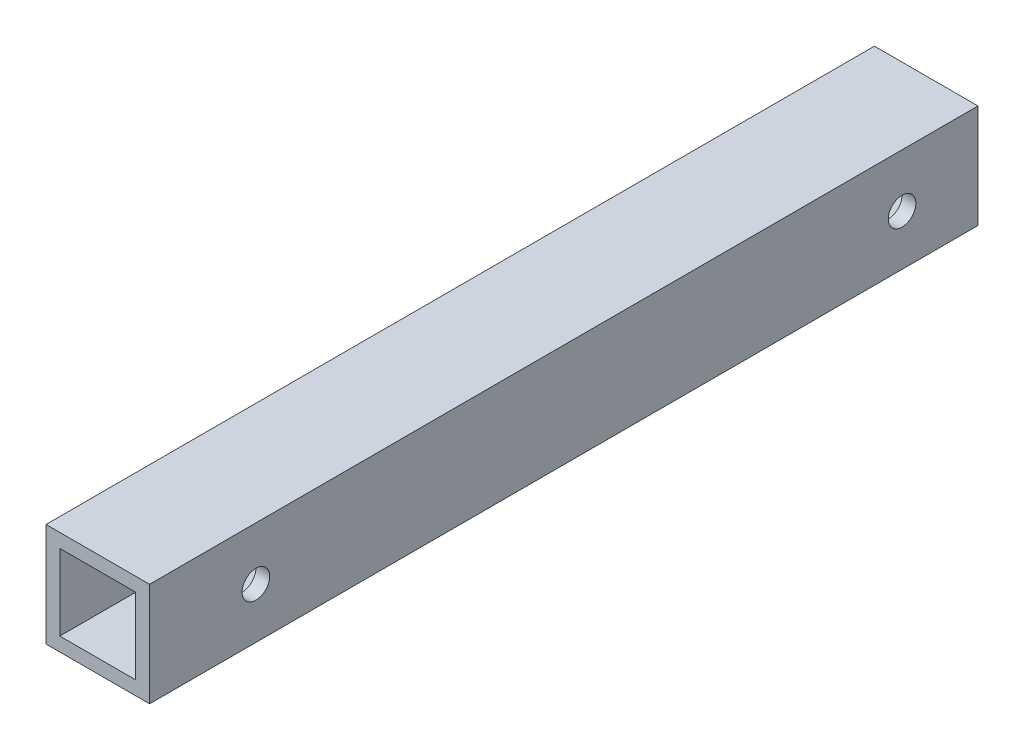
ISO-10303-21;
HEADER;
FILE_DESCRIPTION(('STEP AP214'),'2;1');
FILE_NAME('part.step','',(''),(''),'','','');
FILE_SCHEMA(('AUTOMOTIVE_DESIGN { 1 0 10303 214 1 1 1 1 }'));
ENDSEC;
DATA;
#1=APPLICATION_CONTEXT('core data for automotive mechanical design processes');
#2=APPLICATION_PROTOCOL_DEFINITION('international standard','automotive_design',2000,#1);
#3=PRODUCT_CONTEXT('',#1,'mechanical');
#4=PRODUCT('Part','Part','',(#3));
#5=PRODUCT_RELATED_PRODUCT_CATEGORY('part','',(#4));
#6=PRODUCT_DEFINITION_FORMATION('','',#4);
#7=PRODUCT_DEFINITION_CONTEXT('part definition',#1,'design');
#8=PRODUCT_DEFINITION('design','',#6,#7);
#9=PRODUCT_DEFINITION_SHAPE('','',#8);
#10=(LENGTH_UNIT() NAMED_UNIT(*) SI_UNIT(.MILLI.,.METRE.));
#11=(NAMED_UNIT(*) PLANE_ANGLE_UNIT() SI_UNIT($,.RADIAN.));
#12=(NAMED_UNIT(*) SI_UNIT($,.STERADIAN.) SOLID_ANGLE_UNIT());
#13=UNCERTAINTY_MEASURE_WITH_UNIT(LENGTH_MEASURE(1.E-05),#10,'distance_accuracy_value','');
#14=(GEOMETRIC_REPRESENTATION_CONTEXT(3) GLOBAL_UNCERTAINTY_ASSIGNED_CONTEXT((#13)) GLOBAL_UNIT_ASSIGNED_CONTEXT((#10,
#11,#12)) REPRESENTATION_CONTEXT('',''));
#15=CARTESIAN_POINT('',(0.,0.,0.));
#16=DIRECTION('',(0.,0.,1.));
#17=DIRECTION('',(1.,0.,0.));
#18=AXIS2_PLACEMENT_3D('',#15,#16,#17);
#19=CARTESIAN_POINT('',(0.,0.,60.));
#20=DIRECTION('',(0.,0.,1.));
#21=DIRECTION('',(1.,0.,0.));
#22=AXIS2_PLACEMENT_3D('',#19,#20,#21);
#23=PLANE('',#22);
#24=DIRECTION('',(0.,-1.,0.));
#25=VECTOR('',#24,1.);
#26=CARTESIAN_POINT('',(-7.5,-7.5,60.));
#27=LINE('',#26,#25);
#28=CARTESIAN_POINT('',(-7.5,7.5,60.));
#29=VERTEX_POINT('',#28);
#30=CARTESIAN_POINT('',(-7.5,-7.5,60.));
#31=VERTEX_POINT('',#30);
#32=EDGE_CURVE('E152',#29,#31,#27,.T.);
#33=ORIENTED_EDGE('',*,*,#32,.T.);
#34=DIRECTION('',(1.,0.,0.));
#35=VECTOR('',#34,1.);
#36=CARTESIAN_POINT('',(7.5,-7.5,60.));
#37=LINE('',#36,#35);
#38=CARTESIAN_POINT('',(7.5,-7.5,60.));
#39=VERTEX_POINT('',#38);
#40=EDGE_CURVE('E155',#31,#39,#37,.T.);
#41=ORIENTED_EDGE('',*,*,#40,.T.);
#42=DIRECTION('',(0.,1.,0.));
#43=VECTOR('',#42,1.);
#44=CARTESIAN_POINT('',(7.5,-7.5,60.));
#45=LINE('',#44,#43);
#46=CARTESIAN_POINT('',(7.5,7.5,60.));
#47=VERTEX_POINT('',#46);
#48=EDGE_CURVE('E158',#39,#47,#45,.T.);
#49=ORIENTED_EDGE('',*,*,#48,.T.);
#50=DIRECTION('',(-1.,0.,0.));
#51=VECTOR('',#50,1.);
#52=CARTESIAN_POINT('',(7.5,7.5,60.));
#53=LINE('',#52,#51);
#54=EDGE_CURVE('E160',#47,#29,#53,.T.);
#55=ORIENTED_EDGE('',*,*,#54,.T.);
#56=EDGE_LOOP('',(#33,#41,#49,#55));
#57=FACE_BOUND('',#56,.T.);
#58=DIRECTION('',(-1.,0.,0.));
#59=VECTOR('',#58,1.);
#60=CARTESIAN_POINT('',(5.5,5.5,60.));
#61=LINE('',#60,#59);
#62=CARTESIAN_POINT('',(5.5,5.5,60.));
#63=VERTEX_POINT('',#62);
#64=CARTESIAN_POINT('',(-5.5,5.5,60.));
#65=VERTEX_POINT('',#64);
#66=EDGE_CURVE('E122',#63,#65,#61,.T.);
#67=ORIENTED_EDGE('',*,*,#66,.F.);
#68=DIRECTION('',(0.,1.,0.));
#69=VECTOR('',#68,1.);
#70=CARTESIAN_POINT('',(5.5,-5.5,60.));
#71=LINE('',#70,#69);
#72=CARTESIAN_POINT('',(5.5,-5.5,60.));
#73=VERTEX_POINT('',#72);
#74=EDGE_CURVE('E114',#73,#63,#71,.T.);
#75=ORIENTED_EDGE('',*,*,#74,.F.);
#76=DIRECTION('',(1.,0.,0.));
#77=VECTOR('',#76,1.);
#78=CARTESIAN_POINT('',(5.5,-5.5,60.));
#79=LINE('',#78,#77);
#80=CARTESIAN_POINT('',(-5.5,-5.5,60.));
#81=VERTEX_POINT('',#80);
#82=EDGE_CURVE('E136',#81,#73,#79,.T.);
#83=ORIENTED_EDGE('',*,*,#82,.F.);
#84=DIRECTION('',(0.,-1.,0.));
#85=VECTOR('',#84,1.);
#86=CARTESIAN_POINT('',(-5.5,-5.5,60.));
#87=LINE('',#86,#85);
#88=EDGE_CURVE('E134',#65,#81,#87,.T.);
#89=ORIENTED_EDGE('',*,*,#88,.F.);
#90=EDGE_LOOP('',(#67,#75,#83,#89));
#91=FACE_BOUND('',#90,.T.);
#92=ADVANCED_FACE('F47',(#57,#91),#23,.T.);
#93=CARTESIAN_POINT('',(0.,0.,-60.));
#94=DIRECTION('',(0.,0.,1.));
#95=DIRECTION('',(1.,0.,0.));
#96=AXIS2_PLACEMENT_3D('',#93,#94,#95);
#97=PLANE('',#96);
#98=DIRECTION('',(0.,-1.,0.));
#99=VECTOR('',#98,1.);
#100=CARTESIAN_POINT('',(-7.5,-7.5,-60.));
#101=LINE('',#100,#99);
#102=CARTESIAN_POINT('',(-7.5,7.5,-60.));
#103=VERTEX_POINT('',#102);
#104=CARTESIAN_POINT('',(-7.5,-7.5,-60.));
#105=VERTEX_POINT('',#104);
#106=EDGE_CURVE('E130',#103,#105,#101,.T.);
#107=ORIENTED_EDGE('',*,*,#106,.F.);
#108=DIRECTION('',(-1.,0.,0.));
#109=VECTOR('',#108,1.);
#110=CARTESIAN_POINT('',(7.5,7.5,-60.));
#111=LINE('',#110,#109);
#112=CARTESIAN_POINT('',(7.5,7.5,-60.));
#113=VERTEX_POINT('',#112);
#114=EDGE_CURVE('E156',#113,#103,#111,.T.);
#115=ORIENTED_EDGE('',*,*,#114,.F.);
#116=DIRECTION('',(0.,1.,0.));
#117=VECTOR('',#116,1.);
#118=CARTESIAN_POINT('',(7.5,-7.5,-60.));
#119=LINE('',#118,#117);
#120=CARTESIAN_POINT('',(7.5,-7.5,-60.));
#121=VERTEX_POINT('',#120);
#122=EDGE_CURVE('E167',#121,#113,#119,.T.);
#123=ORIENTED_EDGE('',*,*,#122,.F.);
#124=DIRECTION('',(1.,0.,0.));
#125=VECTOR('',#124,1.);
#126=CARTESIAN_POINT('',(7.5,-7.5,-60.));
#127=LINE('',#126,#125);
#128=EDGE_CURVE('E165',#105,#121,#127,.T.);
#129=ORIENTED_EDGE('',*,*,#128,.F.);
#130=EDGE_LOOP('',(#107,#115,#123,#129));
#131=FACE_BOUND('',#130,.T.);
#132=DIRECTION('',(0.,1.,0.));
#133=VECTOR('',#132,1.);
#134=CARTESIAN_POINT('',(5.5,-5.5,-60.));
#135=LINE('',#134,#133);
#136=CARTESIAN_POINT('',(5.5,-5.5,-60.));
#137=VERTEX_POINT('',#136);
#138=CARTESIAN_POINT('',(5.5,5.5,-60.));
#139=VERTEX_POINT('',#138);
#140=EDGE_CURVE('E72',#137,#139,#135,.T.);
#141=ORIENTED_EDGE('',*,*,#140,.T.);
#142=DIRECTION('',(-1.,0.,0.));
#143=VECTOR('',#142,1.);
#144=CARTESIAN_POINT('',(5.5,5.5,-60.));
#145=LINE('',#144,#143);
#146=CARTESIAN_POINT('',(-5.5,5.5,-60.));
#147=VERTEX_POINT('',#146);
#148=EDGE_CURVE('E129',#139,#147,#145,.T.);
#149=ORIENTED_EDGE('',*,*,#148,.T.);
#150=DIRECTION('',(0.,-1.,0.));
#151=VECTOR('',#150,1.);
#152=CARTESIAN_POINT('',(-5.5,-5.5,-60.));
#153=LINE('',#152,#151);
#154=CARTESIAN_POINT('',(-5.5,-5.5,-60.));
#155=VERTEX_POINT('',#154);
#156=EDGE_CURVE('E144',#147,#155,#153,.T.);
#157=ORIENTED_EDGE('',*,*,#156,.T.);
#158=DIRECTION('',(1.,0.,0.));
#159=VECTOR('',#158,1.);
#160=CARTESIAN_POINT('',(5.5,-5.5,-60.));
#161=LINE('',#160,#159);
#162=EDGE_CURVE('E123',#155,#137,#161,.T.);
#163=ORIENTED_EDGE('',*,*,#162,.T.);
#164=EDGE_LOOP('',(#141,#149,#157,#163));
#165=FACE_BOUND('',#164,.T.);
#166=ADVANCED_FACE('F218',(#131,#165),#97,.F.);
#167=CARTESIAN_POINT('',(-7.5,-7.5,60.));
#168=DIRECTION('',(1.,0.,0.));
#169=DIRECTION('',(0.,0.,-1.));
#170=AXIS2_PLACEMENT_3D('',#167,#168,#169);
#171=PLANE('',#170);
#172=CARTESIAN_POINT('',(-7.5,-0.199999999999999,44.5990612131772));
#173=DIRECTION('',(1.,0.,0.));
#174=DIRECTION('',(0.,0.,-1.));
#175=AXIS2_PLACEMENT_3D('',#172,#173,#174);
#176=CIRCLE('',#175,2.);
#177=CARTESIAN_POINT('',(-7.5,-0.199999999999999,42.5990612131772));
#178=VERTEX_POINT('',#177);
#179=EDGE_CURVE('E179',#178,#178,#176,.T.);
#180=ORIENTED_EDGE('',*,*,#179,.T.);
#181=EDGE_LOOP('',(#180));
#182=FACE_BOUND('',#181,.T.);
#183=CARTESIAN_POINT('',(-7.5,-0.2,-49.));
#184=DIRECTION('',(1.,0.,0.));
#185=DIRECTION('',(0.,0.,-1.));
#186=AXIS2_PLACEMENT_3D('',#183,#184,#185);
#187=CIRCLE('',#186,2.);
#188=CARTESIAN_POINT('',(-7.5,-0.2,-51.));
#189=VERTEX_POINT('',#188);
#190=EDGE_CURVE('E186',#189,#189,#187,.T.);
#191=ORIENTED_EDGE('',*,*,#190,.T.);
#192=EDGE_LOOP('',(#191));
#193=FACE_BOUND('',#192,.T.);
#194=ORIENTED_EDGE('',*,*,#106,.T.);
#195=DIRECTION('',(0.,0.,-1.));
#196=VECTOR('',#195,1.);
#197=CARTESIAN_POINT('',(-7.5,-7.5,60.));
#198=LINE('',#197,#196);
#199=EDGE_CURVE('E11',#31,#105,#198,.T.);
#200=ORIENTED_EDGE('',*,*,#199,.F.);
#201=ORIENTED_EDGE('',*,*,#32,.F.);
#202=DIRECTION('',(0.,0.,-1.));
#203=VECTOR('',#202,1.);
#204=CARTESIAN_POINT('',(-7.5,7.5,60.));
#205=LINE('',#204,#203);
#206=EDGE_CURVE('E162',#29,#103,#205,.T.);
#207=ORIENTED_EDGE('',*,*,#206,.T.);
#208=EDGE_LOOP('',(#194,#200,#201,#207));
#209=FACE_BOUND('',#208,.T.);
#210=ADVANCED_FACE('F49',(#182,#193,#209),#171,.F.);
#211=CARTESIAN_POINT('',(7.5,-7.5,60.));
#212=DIRECTION('',(0.,1.,0.));
#213=DIRECTION('',(-1.,0.,0.));
#214=AXIS2_PLACEMENT_3D('',#211,#212,#213);
#215=PLANE('',#214);
#216=ORIENTED_EDGE('',*,*,#128,.T.);
#217=DIRECTION('',(0.,0.,-1.));
#218=VECTOR('',#217,1.);
#219=CARTESIAN_POINT('',(7.5,-7.5,60.));
#220=LINE('',#219,#218);
#221=EDGE_CURVE('E56',#39,#121,#220,.T.);
#222=ORIENTED_EDGE('',*,*,#221,.F.);
#223=ORIENTED_EDGE('',*,*,#40,.F.);
#224=ORIENTED_EDGE('',*,*,#199,.T.);
#225=EDGE_LOOP('',(#216,#222,#223,#224));
#226=FACE_BOUND('',#225,.T.);
#227=ADVANCED_FACE('F234',(#226),#215,.F.);
#228=CARTESIAN_POINT('',(7.5,-7.5,60.));
#229=DIRECTION('',(-1.,0.,0.));
#230=DIRECTION('',(0.,0.,1.));
#231=AXIS2_PLACEMENT_3D('',#228,#229,#230);
#232=PLANE('',#231);
#233=CARTESIAN_POINT('',(7.5,-0.199999999999999,44.5990612131772));
#234=DIRECTION('',(-1.,0.,0.));
#235=DIRECTION('',(0.,0.,1.));
#236=AXIS2_PLACEMENT_3D('',#233,#234,#235);
#237=CIRCLE('',#236,2.);
#238=CARTESIAN_POINT('',(7.5,-0.199999999999999,46.5990612131772));
#239=VERTEX_POINT('',#238);
#240=EDGE_CURVE('E142',#239,#239,#237,.T.);
#241=ORIENTED_EDGE('',*,*,#240,.T.);
#242=EDGE_LOOP('',(#241));
#243=FACE_BOUND('',#242,.T.);
#244=CARTESIAN_POINT('',(7.5,-0.2,-49.));
#245=DIRECTION('',(-1.,0.,0.));
#246=DIRECTION('',(0.,0.,1.));
#247=AXIS2_PLACEMENT_3D('',#244,#245,#246);
#248=CIRCLE('',#247,2.);
#249=CARTESIAN_POINT('',(7.5,-0.2,-47.));
#250=VERTEX_POINT('',#249);
#251=EDGE_CURVE('E183',#250,#250,#248,.T.);
#252=ORIENTED_EDGE('',*,*,#251,.T.);
#253=EDGE_LOOP('',(#252));
#254=FACE_BOUND('',#253,.T.);
#255=ORIENTED_EDGE('',*,*,#122,.T.);
#256=DIRECTION('',(0.,0.,-1.));
#257=VECTOR('',#256,1.);
#258=CARTESIAN_POINT('',(7.5,7.5,60.));
#259=LINE('',#258,#257);
#260=EDGE_CURVE('E172',#47,#113,#259,.T.);
#261=ORIENTED_EDGE('',*,*,#260,.F.);
#262=ORIENTED_EDGE('',*,*,#48,.F.);
#263=ORIENTED_EDGE('',*,*,#221,.T.);
#264=EDGE_LOOP('',(#255,#261,#262,#263));
#265=FACE_BOUND('',#264,.T.);
#266=ADVANCED_FACE('F200',(#243,#254,#265),#232,.F.);
#267=CARTESIAN_POINT('',(7.5,7.5,60.));
#268=DIRECTION('',(0.,-1.,0.));
#269=DIRECTION('',(1.,0.,0.));
#270=AXIS2_PLACEMENT_3D('',#267,#268,#269);
#271=PLANE('',#270);
#272=ORIENTED_EDGE('',*,*,#114,.T.);
#273=ORIENTED_EDGE('',*,*,#206,.F.);
#274=ORIENTED_EDGE('',*,*,#54,.F.);
#275=ORIENTED_EDGE('',*,*,#260,.T.);
#276=EDGE_LOOP('',(#272,#273,#274,#275));
#277=FACE_BOUND('',#276,.T.);
#278=ADVANCED_FACE('F229',(#277),#271,.F.);
#279=CARTESIAN_POINT('',(5.5,-5.5,60.));
#280=DIRECTION('',(-1.,0.,0.));
#281=DIRECTION('',(0.,0.,1.));
#282=AXIS2_PLACEMENT_3D('',#279,#280,#281);
#283=PLANE('',#282);
#284=CARTESIAN_POINT('',(5.5,-0.199999999999999,44.5990612131772));
#285=DIRECTION('',(-1.,0.,0.));
#286=DIRECTION('',(0.,0.,1.));
#287=AXIS2_PLACEMENT_3D('',#284,#285,#286);
#288=CIRCLE('',#287,2.);
#289=CARTESIAN_POINT('',(5.5,-0.199999999999999,46.5990612131772));
#290=VERTEX_POINT('',#289);
#291=EDGE_CURVE('E195',#290,#290,#288,.T.);
#292=ORIENTED_EDGE('',*,*,#291,.F.);
#293=EDGE_LOOP('',(#292));
#294=FACE_BOUND('',#293,.T.);
#295=CARTESIAN_POINT('',(5.5,-0.2,-49.));
#296=DIRECTION('',(-1.,0.,0.));
#297=DIRECTION('',(0.,0.,1.));
#298=AXIS2_PLACEMENT_3D('',#295,#296,#297);
#299=CIRCLE('',#298,2.);
#300=CARTESIAN_POINT('',(5.5,-0.2,-47.));
#301=VERTEX_POINT('',#300);
#302=EDGE_CURVE('E178',#301,#301,#299,.T.);
#303=ORIENTED_EDGE('',*,*,#302,.F.);
#304=EDGE_LOOP('',(#303));
#305=FACE_BOUND('',#304,.T.);
#306=ORIENTED_EDGE('',*,*,#140,.F.);
#307=DIRECTION('',(0.,0.,-1.));
#308=VECTOR('',#307,1.);
#309=CARTESIAN_POINT('',(5.5,-5.5,60.));
#310=LINE('',#309,#308);
#311=EDGE_CURVE('E118',#73,#137,#310,.T.);
#312=ORIENTED_EDGE('',*,*,#311,.F.);
#313=ORIENTED_EDGE('',*,*,#74,.T.);
#314=DIRECTION('',(0.,0.,-1.));
#315=VECTOR('',#314,1.);
#316=CARTESIAN_POINT('',(5.5,5.5,60.));
#317=LINE('',#316,#315);
#318=EDGE_CURVE('E117',#63,#139,#317,.T.);
#319=ORIENTED_EDGE('',*,*,#318,.T.);
#320=EDGE_LOOP('',(#306,#312,#313,#319));
#321=FACE_BOUND('',#320,.T.);
#322=ADVANCED_FACE('F116',(#294,#305,#321),#283,.T.);
#323=CARTESIAN_POINT('',(5.5,5.5,60.));
#324=DIRECTION('',(0.,-1.,0.));
#325=DIRECTION('',(1.,0.,0.));
#326=AXIS2_PLACEMENT_3D('',#323,#324,#325);
#327=PLANE('',#326);
#328=ORIENTED_EDGE('',*,*,#148,.F.);
#329=ORIENTED_EDGE('',*,*,#318,.F.);
#330=ORIENTED_EDGE('',*,*,#66,.T.);
#331=DIRECTION('',(0.,0.,-1.));
#332=VECTOR('',#331,1.);
#333=CARTESIAN_POINT('',(-5.5,5.5,60.));
#334=LINE('',#333,#332);
#335=EDGE_CURVE('E131',#65,#147,#334,.T.);
#336=ORIENTED_EDGE('',*,*,#335,.T.);
#337=EDGE_LOOP('',(#328,#329,#330,#336));
#338=FACE_BOUND('',#337,.T.);
#339=ADVANCED_FACE('F126',(#338),#327,.T.);
#340=CARTESIAN_POINT('',(-5.5,-5.5,60.));
#341=DIRECTION('',(1.,0.,0.));
#342=DIRECTION('',(0.,0.,-1.));
#343=AXIS2_PLACEMENT_3D('',#340,#341,#342);
#344=PLANE('',#343);
#345=CARTESIAN_POINT('',(-5.5,-0.199999999999999,44.5990612131772));
#346=DIRECTION('',(1.,0.,0.));
#347=DIRECTION('',(0.,0.,-1.));
#348=AXIS2_PLACEMENT_3D('',#345,#346,#347);
#349=CIRCLE('',#348,2.);
#350=CARTESIAN_POINT('',(-5.5,-0.199999999999999,42.5990612131772));
#351=VERTEX_POINT('',#350);
#352=EDGE_CURVE('E51',#351,#351,#349,.T.);
#353=ORIENTED_EDGE('',*,*,#352,.F.);
#354=EDGE_LOOP('',(#353));
#355=FACE_BOUND('',#354,.T.);
#356=CARTESIAN_POINT('',(-5.5,-0.2,-49.));
#357=DIRECTION('',(1.,0.,0.));
#358=DIRECTION('',(0.,0.,-1.));
#359=AXIS2_PLACEMENT_3D('',#356,#357,#358);
#360=CIRCLE('',#359,2.);
#361=CARTESIAN_POINT('',(-5.5,-0.2,-51.));
#362=VERTEX_POINT('',#361);
#363=EDGE_CURVE('E176',#362,#362,#360,.T.);
#364=ORIENTED_EDGE('',*,*,#363,.F.);
#365=EDGE_LOOP('',(#364));
#366=FACE_BOUND('',#365,.T.);
#367=ORIENTED_EDGE('',*,*,#156,.F.);
#368=ORIENTED_EDGE('',*,*,#335,.F.);
#369=ORIENTED_EDGE('',*,*,#88,.T.);
#370=DIRECTION('',(0.,0.,-1.));
#371=VECTOR('',#370,1.);
#372=CARTESIAN_POINT('',(-5.5,-5.5,60.));
#373=LINE('',#372,#371);
#374=EDGE_CURVE('E64',#81,#155,#373,.T.);
#375=ORIENTED_EDGE('',*,*,#374,.T.);
#376=EDGE_LOOP('',(#367,#368,#369,#375));
#377=FACE_BOUND('',#376,.T.);
#378=ADVANCED_FACE('F256',(#355,#366,#377),#344,.T.);
#379=CARTESIAN_POINT('',(5.5,-5.5,60.));
#380=DIRECTION('',(0.,1.,0.));
#381=DIRECTION('',(-1.,0.,0.));
#382=AXIS2_PLACEMENT_3D('',#379,#380,#381);
#383=PLANE('',#382);
#384=ORIENTED_EDGE('',*,*,#162,.F.);
#385=ORIENTED_EDGE('',*,*,#374,.F.);
#386=ORIENTED_EDGE('',*,*,#82,.T.);
#387=ORIENTED_EDGE('',*,*,#311,.T.);
#388=EDGE_LOOP('',(#384,#385,#386,#387));
#389=FACE_BOUND('',#388,.T.);
#390=ADVANCED_FACE('F254',(#389),#383,.T.);
#391=CARTESIAN_POINT('',(-7.5,-0.2,-49.));
#392=DIRECTION('',(1.,0.,0.));
#393=DIRECTION('',(0.,0.,-1.));
#394=AXIS2_PLACEMENT_3D('',#391,#392,#393);
#395=CYLINDRICAL_SURFACE('',#394,2.);
#396=ORIENTED_EDGE('',*,*,#363,.T.);
#397=EDGE_LOOP('',(#396));
#398=FACE_BOUND('',#397,.T.);
#399=ORIENTED_EDGE('',*,*,#190,.F.);
#400=EDGE_LOOP('',(#399));
#401=FACE_BOUND('',#400,.T.);
#402=ADVANCED_FACE('F214',(#398,#401),#395,.F.);
#403=CARTESIAN_POINT('',(-7.5,-0.199999999999999,44.5990612131772));
#404=DIRECTION('',(1.,0.,0.));
#405=DIRECTION('',(0.,0.,-1.));
#406=AXIS2_PLACEMENT_3D('',#403,#404,#405);
#407=CYLINDRICAL_SURFACE('',#406,2.);
#408=ORIENTED_EDGE('',*,*,#352,.T.);
#409=EDGE_LOOP('',(#408));
#410=FACE_BOUND('',#409,.T.);
#411=ORIENTED_EDGE('',*,*,#179,.F.);
#412=EDGE_LOOP('',(#411));
#413=FACE_BOUND('',#412,.T.);
#414=ADVANCED_FACE('F208',(#410,#413),#407,.F.);
#415=ORIENTED_EDGE('',*,*,#302,.T.);
#416=EDGE_LOOP('',(#415));
#417=FACE_BOUND('',#416,.T.);
#418=ORIENTED_EDGE('',*,*,#251,.F.);
#419=EDGE_LOOP('',(#418));
#420=FACE_BOUND('',#419,.T.);
#421=ADVANCED_FACE('F205',(#417,#420),#395,.F.);
#422=ORIENTED_EDGE('',*,*,#291,.T.);
#423=EDGE_LOOP('',(#422));
#424=FACE_BOUND('',#423,.T.);
#425=ORIENTED_EDGE('',*,*,#240,.F.);
#426=EDGE_LOOP('',(#425));
#427=FACE_BOUND('',#426,.T.);
#428=ADVANCED_FACE('F203',(#424,#427),#407,.F.);
#429=CLOSED_SHELL('',(#92,#166,#210,#227,#266,#278,#322,#339,#378,#390,#402,#414,#421,#428));
#430=MANIFOLD_SOLID_BREP('B2',#429);
#431=ADVANCED_BREP_SHAPE_REPRESENTATION('',(#18,#430),#14);
#432=SHAPE_DEFINITION_REPRESENTATION(#9,#431);
ENDSEC;
END-ISO-10303-21;
